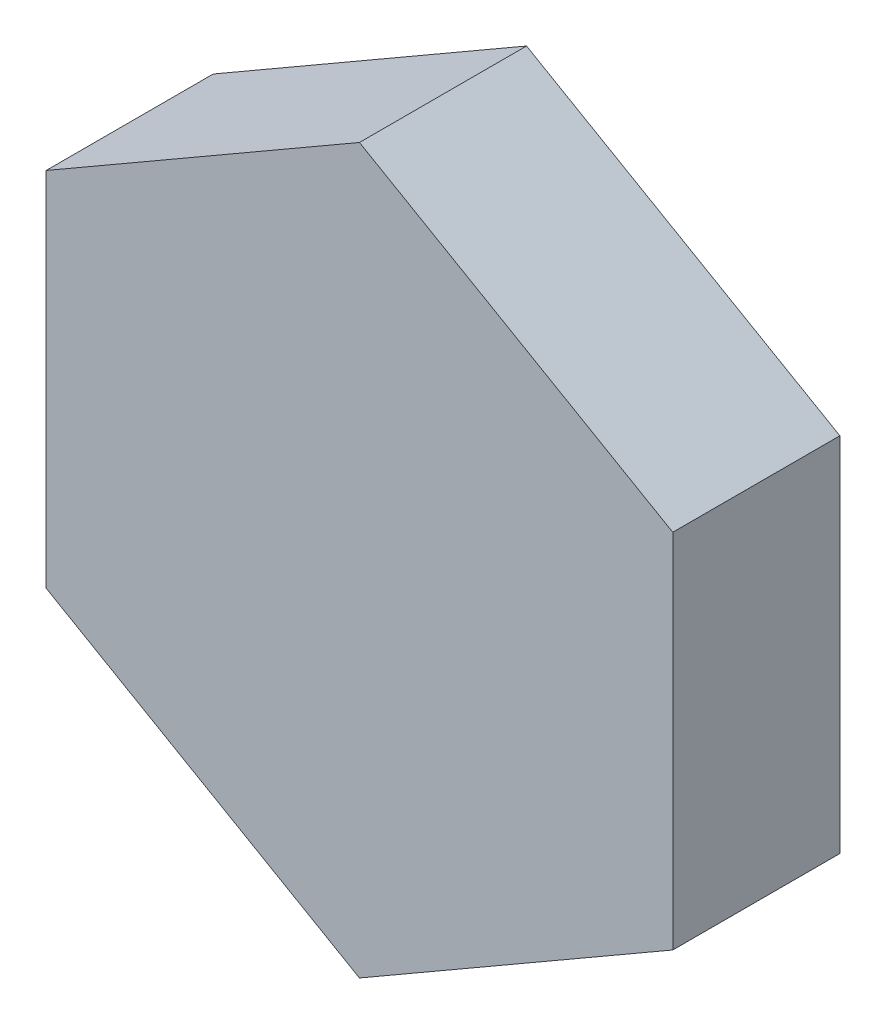
ISO-10303-21;
HEADER;
FILE_DESCRIPTION(('STEP AP214'),'2;1');
FILE_NAME('part.step','',(''),(''),'','','');
FILE_SCHEMA(('AUTOMOTIVE_DESIGN { 1 0 10303 214 1 1 1 1 }'));
ENDSEC;
DATA;
#1=APPLICATION_CONTEXT('core data for automotive mechanical design processes');
#2=APPLICATION_PROTOCOL_DEFINITION('international standard','automotive_design',2000,#1);
#3=PRODUCT_CONTEXT('',#1,'mechanical');
#4=PRODUCT('Part','Part','',(#3));
#5=PRODUCT_RELATED_PRODUCT_CATEGORY('part','',(#4));
#6=PRODUCT_DEFINITION_FORMATION('','',#4);
#7=PRODUCT_DEFINITION_CONTEXT('part definition',#1,'design');
#8=PRODUCT_DEFINITION('design','',#6,#7);
#9=PRODUCT_DEFINITION_SHAPE('','',#8);
#10=(LENGTH_UNIT() NAMED_UNIT(*) SI_UNIT(.MILLI.,.METRE.));
#11=(NAMED_UNIT(*) PLANE_ANGLE_UNIT() SI_UNIT($,.RADIAN.));
#12=(NAMED_UNIT(*) SI_UNIT($,.STERADIAN.) SOLID_ANGLE_UNIT());
#13=UNCERTAINTY_MEASURE_WITH_UNIT(LENGTH_MEASURE(1.E-05),#10,'distance_accuracy_value','');
#14=(GEOMETRIC_REPRESENTATION_CONTEXT(3) GLOBAL_UNCERTAINTY_ASSIGNED_CONTEXT((#13)) GLOBAL_UNIT_ASSIGNED_CONTEXT((#10,
#11,#12)) REPRESENTATION_CONTEXT('',''));
#15=CARTESIAN_POINT('',(0.,0.,0.));
#16=DIRECTION('',(0.,0.,1.));
#17=DIRECTION('',(1.,0.,0.));
#18=AXIS2_PLACEMENT_3D('',#15,#16,#17);
#19=CARTESIAN_POINT('',(-30.1703889884342,-200.89166,-0.4));
#20=DIRECTION('',(0.,0.,1.));
#21=DIRECTION('',(-1.,0.,0.));
#22=AXIS2_PLACEMENT_3D('',#19,#20,#21);
#23=PLANE('',#22);
#24=CARTESIAN_POINT('',(-32.2787289884343,-203.,-0.4));
#25=DIRECTION('',(0.,0.,1.));
#26=DIRECTION('',(1.,0.,0.));
#27=AXIS2_PLACEMENT_3D('',#24,#25,#26);
#28=CIRCLE('',#27,2.06700000000002);
#29=CARTESIAN_POINT('',(-30.2117289884342,-203.,-0.4));
#30=VERTEX_POINT('',#29);
#31=EDGE_CURVE('E20',#30,#30,#28,.F.);
#32=ORIENTED_EDGE('',*,*,#31,.T.);
#33=EDGE_LOOP('',(#32));
#34=FACE_BOUND('',#33,.T.);
#35=ADVANCED_FACE('F16',(#34),#23,.F.);
#36=CARTESIAN_POINT('',(-32.2787289884343,-203.,-1.6));
#37=DIRECTION('',(0.,0.,1.));
#38=DIRECTION('',(1.,0.,0.));
#39=AXIS2_PLACEMENT_3D('',#36,#37,#38);
#40=CYLINDRICAL_SURFACE('',#39,2.06700000000002);
#41=ORIENTED_EDGE('',*,*,#31,.F.);
#42=EDGE_LOOP('',(#41));
#43=FACE_BOUND('',#42,.T.);
#44=CARTESIAN_POINT('',(-32.2787289884343,-203.,-1.6));
#45=DIRECTION('',(0.,0.,1.));
#46=DIRECTION('',(1.,0.,0.));
#47=AXIS2_PLACEMENT_3D('',#44,#45,#46);
#48=CIRCLE('',#47,2.06700000000002);
#49=CARTESIAN_POINT('',(-30.2117289884342,-203.,-1.6));
#50=VERTEX_POINT('',#49);
#51=EDGE_CURVE('E86',#50,#50,#48,.F.);
#52=ORIENTED_EDGE('',*,*,#51,.T.);
#53=EDGE_LOOP('',(#52));
#54=FACE_BOUND('',#53,.T.);
#55=ADVANCED_FACE('F18',(#43,#54),#40,.F.);
#56=CARTESIAN_POINT('',(-32.2787289884342,-203.,-1.6));
#57=DIRECTION('',(0.,0.,1.));
#58=DIRECTION('',(1.,0.,0.));
#59=AXIS2_PLACEMENT_3D('',#56,#57,#58);
#60=PLANE('',#59);
#61=ORIENTED_EDGE('',*,*,#51,.F.);
#62=EDGE_LOOP('',(#61));
#63=FACE_BOUND('',#62,.T.);
#64=DIRECTION('',(0.,1.,0.));
#65=VECTOR('',#64,1.);
#66=CARTESIAN_POINT('',(-29.2787289884343,-204.732050807569,-1.6));
#67=LINE('',#66,#65);
#68=CARTESIAN_POINT('',(-29.2787289884343,-204.732050807569,-1.6));
#69=VERTEX_POINT('',#68);
#70=CARTESIAN_POINT('',(-29.2787289884342,-201.267949192431,-1.6));
#71=VERTEX_POINT('',#70);
#72=EDGE_CURVE('E73',#69,#71,#67,.T.);
#73=ORIENTED_EDGE('',*,*,#72,.F.);
#74=DIRECTION('',(0.866025403784442,0.499999999999994,0.));
#75=VECTOR('',#74,1.);
#76=CARTESIAN_POINT('',(-32.2787289884342,-206.464101615138,-1.6));
#77=LINE('',#76,#75);
#78=CARTESIAN_POINT('',(-32.2787289884342,-206.464101615138,-1.6));
#79=VERTEX_POINT('',#78);
#80=EDGE_CURVE('E194',#79,#69,#77,.T.);
#81=ORIENTED_EDGE('',*,*,#80,.F.);
#82=DIRECTION('',(0.866025403784432,-0.500000000000011,0.));
#83=VECTOR('',#82,1.);
#84=CARTESIAN_POINT('',(-35.2787289884342,-204.732050807569,-1.6));
#85=LINE('',#84,#83);
#86=CARTESIAN_POINT('',(-35.2787289884342,-204.732050807569,-1.6));
#87=VERTEX_POINT('',#86);
#88=EDGE_CURVE('E199',#87,#79,#85,.T.);
#89=ORIENTED_EDGE('',*,*,#88,.F.);
#90=DIRECTION('',(0.,1.,0.));
#91=VECTOR('',#90,1.);
#92=CARTESIAN_POINT('',(-35.2787289884342,-201.267949192431,-1.6));
#93=LINE('',#92,#91);
#94=CARTESIAN_POINT('',(-35.2787289884342,-201.267949192431,-1.6));
#95=VERTEX_POINT('',#94);
#96=EDGE_CURVE('E202',#95,#87,#93,.F.);
#97=ORIENTED_EDGE('',*,*,#96,.F.);
#98=DIRECTION('',(-0.86602540378444,-0.499999999999997,0.));
#99=VECTOR('',#98,1.);
#100=CARTESIAN_POINT('',(-32.2787289884342,-199.535898384862,-1.6));
#101=LINE('',#100,#99);
#102=CARTESIAN_POINT('',(-32.2787289884342,-199.535898384862,-1.6));
#103=VERTEX_POINT('',#102);
#104=EDGE_CURVE('E68',#103,#95,#101,.T.);
#105=ORIENTED_EDGE('',*,*,#104,.F.);
#106=DIRECTION('',(-0.866025403784426,0.500000000000022,0.));
#107=VECTOR('',#106,1.);
#108=CARTESIAN_POINT('',(-29.2787289884342,-201.267949192431,-1.6));
#109=LINE('',#108,#107);
#110=EDGE_CURVE('E70',#71,#103,#109,.T.);
#111=ORIENTED_EDGE('',*,*,#110,.F.);
#112=EDGE_LOOP('',(#73,#81,#89,#97,#105,#111));
#113=FACE_BOUND('',#112,.T.);
#114=ADVANCED_FACE('F72',(#63,#113),#60,.F.);
#115=CARTESIAN_POINT('',(-29.2787289884343,-204.732050807569,0.));
#116=DIRECTION('',(1.,0.,0.));
#117=DIRECTION('',(0.,0.,-1.));
#118=AXIS2_PLACEMENT_3D('',#115,#116,#117);
#119=PLANE('',#118);
#120=DIRECTION('',(0.,1.,0.));
#121=VECTOR('',#120,1.);
#122=CARTESIAN_POINT('',(-29.2787289884343,-203.,0.));
#123=LINE('',#122,#121);
#124=CARTESIAN_POINT('',(-29.2787289884343,-204.732050807569,0.));
#125=VERTEX_POINT('',#124);
#126=CARTESIAN_POINT('',(-29.2787289884342,-201.267949192431,0.));
#127=VERTEX_POINT('',#126);
#128=EDGE_CURVE('E187',#125,#127,#123,.T.);
#129=ORIENTED_EDGE('',*,*,#128,.F.);
#130=DIRECTION('',(0.,0.,1.));
#131=VECTOR('',#130,1.);
#132=CARTESIAN_POINT('',(-29.2787289884343,-204.732050807569,0.));
#133=LINE('',#132,#131);
#134=EDGE_CURVE('E84',#69,#125,#133,.T.);
#135=ORIENTED_EDGE('',*,*,#134,.F.);
#136=ORIENTED_EDGE('',*,*,#72,.T.);
#137=DIRECTION('',(0.,0.,1.));
#138=VECTOR('',#137,1.);
#139=CARTESIAN_POINT('',(-29.2787289884342,-201.267949192431,0.));
#140=LINE('',#139,#138);
#141=EDGE_CURVE('E78',#127,#71,#140,.F.);
#142=ORIENTED_EDGE('',*,*,#141,.F.);
#143=EDGE_LOOP('',(#129,#135,#136,#142));
#144=FACE_BOUND('',#143,.T.);
#145=ADVANCED_FACE('F81',(#144),#119,.T.);
#146=CARTESIAN_POINT('',(-29.2787289884342,-201.267949192431,0.));
#147=DIRECTION('',(0.500000000000022,0.866025403784426,0.));
#148=DIRECTION('',(-0.866025403784426,0.500000000000022,0.));
#149=AXIS2_PLACEMENT_3D('',#146,#147,#148);
#150=PLANE('',#149);
#151=DIRECTION('',(-0.866025403784423,0.500000000000027,0.));
#152=VECTOR('',#151,1.);
#153=CARTESIAN_POINT('',(-29.2787289884342,-201.267949192431,0.));
#154=LINE('',#153,#152);
#155=CARTESIAN_POINT('',(-32.2787289884342,-199.535898384862,0.));
#156=VERTEX_POINT('',#155);
#157=EDGE_CURVE('E90',#127,#156,#154,.T.);
#158=ORIENTED_EDGE('',*,*,#157,.F.);
#159=ORIENTED_EDGE('',*,*,#141,.T.);
#160=ORIENTED_EDGE('',*,*,#110,.T.);
#161=DIRECTION('',(0.,0.,1.));
#162=VECTOR('',#161,1.);
#163=CARTESIAN_POINT('',(-32.2787289884342,-199.535898384862,0.));
#164=LINE('',#163,#162);
#165=EDGE_CURVE('E93',#156,#103,#164,.F.);
#166=ORIENTED_EDGE('',*,*,#165,.F.);
#167=EDGE_LOOP('',(#158,#159,#160,#166));
#168=FACE_BOUND('',#167,.T.);
#169=ADVANCED_FACE('F88',(#168),#150,.T.);
#170=CARTESIAN_POINT('',(-32.2787289884342,-199.535898384862,0.));
#171=DIRECTION('',(-0.499999999999997,0.86602540378444,0.));
#172=DIRECTION('',(-0.86602540378444,-0.499999999999997,0.));
#173=AXIS2_PLACEMENT_3D('',#170,#171,#172);
#174=PLANE('',#173);
#175=DIRECTION('',(-0.866025403784442,-0.499999999999995,0.));
#176=VECTOR('',#175,1.);
#177=CARTESIAN_POINT('',(-32.2787289884342,-199.535898384862,0.));
#178=LINE('',#177,#176);
#179=CARTESIAN_POINT('',(-35.2787289884342,-201.267949192431,0.));
#180=VERTEX_POINT('',#179);
#181=EDGE_CURVE('E180',#156,#180,#178,.T.);
#182=ORIENTED_EDGE('',*,*,#181,.F.);
#183=ORIENTED_EDGE('',*,*,#165,.T.);
#184=ORIENTED_EDGE('',*,*,#104,.T.);
#185=DIRECTION('',(0.,0.,1.));
#186=VECTOR('',#185,1.);
#187=CARTESIAN_POINT('',(-35.2787289884342,-201.267949192431,0.));
#188=LINE('',#187,#186);
#189=EDGE_CURVE('E182',#180,#95,#188,.F.);
#190=ORIENTED_EDGE('',*,*,#189,.F.);
#191=EDGE_LOOP('',(#182,#183,#184,#190));
#192=FACE_BOUND('',#191,.T.);
#193=ADVANCED_FACE('F129',(#192),#174,.T.);
#194=CARTESIAN_POINT('',(-35.2787289884342,-201.267949192431,0.));
#195=DIRECTION('',(-1.,0.,0.));
#196=DIRECTION('',(0.,0.,1.));
#197=AXIS2_PLACEMENT_3D('',#194,#195,#196);
#198=PLANE('',#197);
#199=DIRECTION('',(0.,1.,0.));
#200=VECTOR('',#199,1.);
#201=CARTESIAN_POINT('',(-35.2787289884342,-203.,0.));
#202=LINE('',#201,#200);
#203=CARTESIAN_POINT('',(-35.2787289884342,-204.732050807569,0.));
#204=VERTEX_POINT('',#203);
#205=EDGE_CURVE('E185',#180,#204,#202,.F.);
#206=ORIENTED_EDGE('',*,*,#205,.F.);
#207=ORIENTED_EDGE('',*,*,#189,.T.);
#208=ORIENTED_EDGE('',*,*,#96,.T.);
#209=DIRECTION('',(0.,0.,1.));
#210=VECTOR('',#209,1.);
#211=CARTESIAN_POINT('',(-35.2787289884342,-204.732050807569,0.));
#212=LINE('',#211,#210);
#213=EDGE_CURVE('E196',#204,#87,#212,.F.);
#214=ORIENTED_EDGE('',*,*,#213,.F.);
#215=EDGE_LOOP('',(#206,#207,#208,#214));
#216=FACE_BOUND('',#215,.T.);
#217=ADVANCED_FACE('F126',(#216),#198,.T.);
#218=CARTESIAN_POINT('',(-35.2787289884342,-204.732050807569,0.));
#219=DIRECTION('',(-0.500000000000011,-0.866025403784432,0.));
#220=DIRECTION('',(0.866025403784432,-0.500000000000011,0.));
#221=AXIS2_PLACEMENT_3D('',#218,#219,#220);
#222=PLANE('',#221);
#223=DIRECTION('',(0.866025403784431,-0.500000000000014,0.));
#224=VECTOR('',#223,1.);
#225=CARTESIAN_POINT('',(-35.2787289884342,-204.732050807569,0.));
#226=LINE('',#225,#224);
#227=CARTESIAN_POINT('',(-32.2787289884342,-206.464101615138,0.));
#228=VERTEX_POINT('',#227);
#229=EDGE_CURVE('E26',#204,#228,#226,.T.);
#230=ORIENTED_EDGE('',*,*,#229,.F.);
#231=ORIENTED_EDGE('',*,*,#213,.T.);
#232=ORIENTED_EDGE('',*,*,#88,.T.);
#233=DIRECTION('',(0.,0.,1.));
#234=VECTOR('',#233,1.);
#235=CARTESIAN_POINT('',(-32.2787289884342,-206.464101615138,0.));
#236=LINE('',#235,#234);
#237=EDGE_CURVE('E35',#228,#79,#236,.F.);
#238=ORIENTED_EDGE('',*,*,#237,.F.);
#239=EDGE_LOOP('',(#230,#231,#232,#238));
#240=FACE_BOUND('',#239,.T.);
#241=ADVANCED_FACE('F119',(#240),#222,.T.);
#242=CARTESIAN_POINT('',(-32.2787289884342,-206.464101615138,0.));
#243=DIRECTION('',(0.499999999999994,-0.866025403784442,0.));
#244=DIRECTION('',(0.866025403784442,0.499999999999994,0.));
#245=AXIS2_PLACEMENT_3D('',#242,#243,#244);
#246=PLANE('',#245);
#247=DIRECTION('',(0.866025403784442,0.499999999999994,0.));
#248=VECTOR('',#247,1.);
#249=CARTESIAN_POINT('',(-32.2787289884342,-206.464101615138,0.));
#250=LINE('',#249,#248);
#251=EDGE_CURVE('E10',#228,#125,#250,.T.);
#252=ORIENTED_EDGE('',*,*,#251,.F.);
#253=ORIENTED_EDGE('',*,*,#237,.T.);
#254=ORIENTED_EDGE('',*,*,#80,.T.);
#255=ORIENTED_EDGE('',*,*,#134,.T.);
#256=EDGE_LOOP('',(#252,#253,#254,#255));
#257=FACE_BOUND('',#256,.T.);
#258=ADVANCED_FACE('F113',(#257),#246,.T.);
#259=CARTESIAN_POINT('',(-32.2787289884342,-203.,0.));
#260=DIRECTION('',(0.,0.,1.));
#261=DIRECTION('',(1.,0.,0.));
#262=AXIS2_PLACEMENT_3D('',#259,#260,#261);
#263=PLANE('',#262);
#264=ORIENTED_EDGE('',*,*,#229,.T.);
#265=ORIENTED_EDGE('',*,*,#251,.T.);
#266=ORIENTED_EDGE('',*,*,#128,.T.);
#267=ORIENTED_EDGE('',*,*,#157,.T.);
#268=ORIENTED_EDGE('',*,*,#181,.T.);
#269=ORIENTED_EDGE('',*,*,#205,.T.);
#270=EDGE_LOOP('',(#264,#265,#266,#267,#268,#269));
#271=FACE_BOUND('',#270,.T.);
#272=ADVANCED_FACE('F111',(#271),#263,.T.);
#273=CLOSED_SHELL('',(#35,#55,#114,#145,#169,#193,#217,#241,#258,#272));
#274=MANIFOLD_SOLID_BREP('B1',#273);
#275=ADVANCED_BREP_SHAPE_REPRESENTATION('',(#18,#274),#14);
#276=SHAPE_DEFINITION_REPRESENTATION(#9,#275);
ENDSEC;
END-ISO-10303-21;
